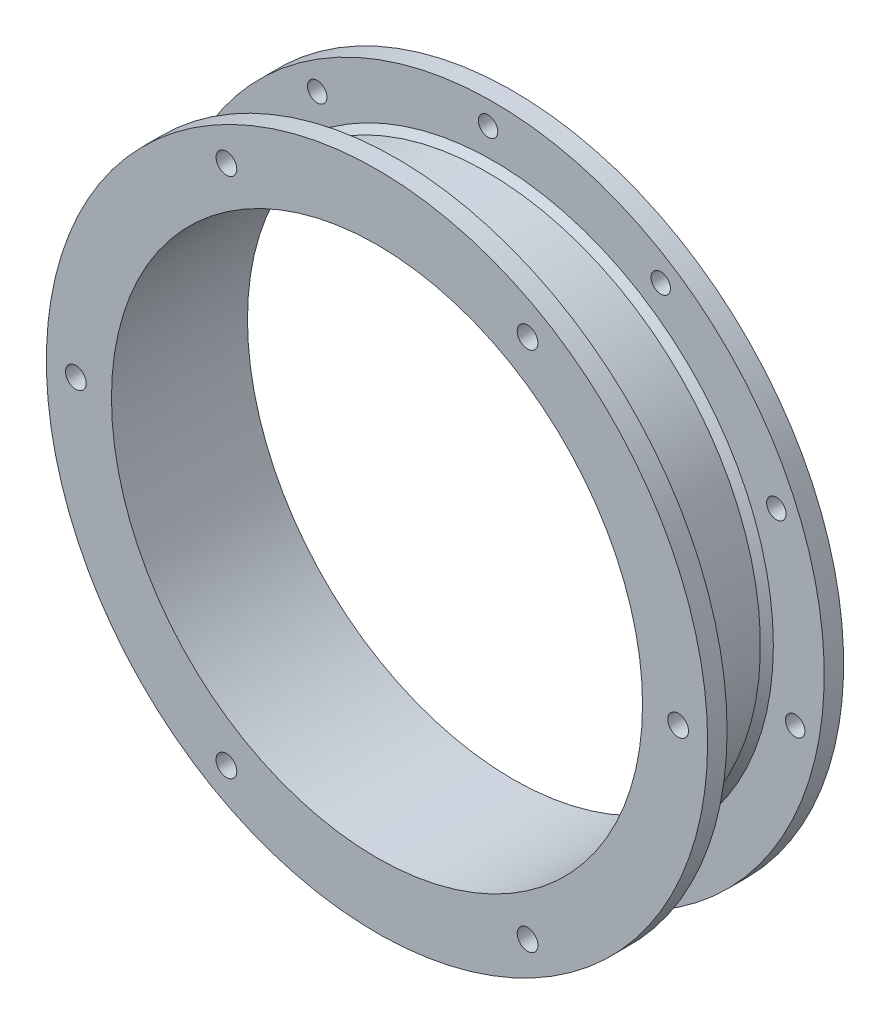
ISO-10303-21;
HEADER;
FILE_DESCRIPTION(('STEP AP214'),'2;1');
FILE_NAME('part.step','',(''),(''),'','','');
FILE_SCHEMA(('AUTOMOTIVE_DESIGN { 1 0 10303 214 1 1 1 1 }'));
ENDSEC;
DATA;
#1=APPLICATION_CONTEXT('core data for automotive mechanical design processes');
#2=APPLICATION_PROTOCOL_DEFINITION('international standard','automotive_design',2000,#1);
#3=PRODUCT_CONTEXT('',#1,'mechanical');
#4=PRODUCT('Part','Part','',(#3));
#5=PRODUCT_RELATED_PRODUCT_CATEGORY('part','',(#4));
#6=PRODUCT_DEFINITION_FORMATION('','',#4);
#7=PRODUCT_DEFINITION_CONTEXT('part definition',#1,'design');
#8=PRODUCT_DEFINITION('design','',#6,#7);
#9=PRODUCT_DEFINITION_SHAPE('','',#8);
#10=(LENGTH_UNIT() NAMED_UNIT(*) SI_UNIT(.MILLI.,.METRE.));
#11=(NAMED_UNIT(*) PLANE_ANGLE_UNIT() SI_UNIT($,.RADIAN.));
#12=(NAMED_UNIT(*) SI_UNIT($,.STERADIAN.) SOLID_ANGLE_UNIT());
#13=UNCERTAINTY_MEASURE_WITH_UNIT(LENGTH_MEASURE(1.E-05),#10,'distance_accuracy_value','');
#14=(GEOMETRIC_REPRESENTATION_CONTEXT(3) GLOBAL_UNCERTAINTY_ASSIGNED_CONTEXT((#13)) GLOBAL_UNIT_ASSIGNED_CONTEXT((#10,
#11,#12)) REPRESENTATION_CONTEXT('',''));
#15=CARTESIAN_POINT('',(0.,0.,0.));
#16=DIRECTION('',(0.,0.,1.));
#17=DIRECTION('',(1.,0.,0.));
#18=AXIS2_PLACEMENT_3D('',#15,#16,#17);
#19=CARTESIAN_POINT('',(-1.8002134656574,-86.,140.359624664289));
#20=DIRECTION('',(0.,0.,-1.));
#21=DIRECTION('',(-1.,0.,0.));
#22=AXIS2_PLACEMENT_3D('',#19,#20,#21);
#23=CYLINDRICAL_SURFACE('',#22,42.2);
#24=CARTESIAN_POINT('',(-1.8002134656574,-86.,17.));
#25=DIRECTION('',(0.,0.,1.));
#26=DIRECTION('',(1.,0.,0.));
#27=AXIS2_PLACEMENT_3D('',#24,#25,#26);
#28=CIRCLE('',#27,42.2);
#29=CARTESIAN_POINT('',(40.3997865343426,-86.,17.));
#30=VERTEX_POINT('',#29);
#31=EDGE_CURVE('E39',#30,#30,#28,.F.);
#32=ORIENTED_EDGE('',*,*,#31,.T.);
#33=EDGE_LOOP('',(#32));
#34=FACE_BOUND('',#33,.T.);
#35=CARTESIAN_POINT('',(-1.8002134656574,-86.,4.));
#36=DIRECTION('',(0.,0.,-1.));
#37=DIRECTION('',(-1.,0.,0.));
#38=AXIS2_PLACEMENT_3D('',#35,#36,#37);
#39=CIRCLE('',#38,42.2);
#40=CARTESIAN_POINT('',(-44.0002134656574,-86.,4.));
#41=VERTEX_POINT('',#40);
#42=EDGE_CURVE('E43',#41,#41,#39,.F.);
#43=ORIENTED_EDGE('',*,*,#42,.T.);
#44=EDGE_LOOP('',(#43));
#45=FACE_BOUND('',#44,.T.);
#46=ADVANCED_FACE('F32',(#34,#45),#23,.T.);
#47=CARTESIAN_POINT('',(-1.8002134656574,-86.,0.));
#48=DIRECTION('',(0.,0.,1.));
#49=DIRECTION('',(1.,0.,0.));
#50=AXIS2_PLACEMENT_3D('',#47,#48,#49);
#51=PLANE('',#50);
#52=CARTESIAN_POINT('',(44.7715124932127,-95.0289246310107,0.));
#53=DIRECTION('',(0.,0.,1.));
#54=DIRECTION('',(1.,0.,0.));
#55=AXIS2_PLACEMENT_3D('',#52,#53,#54);
#56=CIRCLE('',#55,1.5);
#57=CARTESIAN_POINT('',(46.2715124932127,-95.0289246310107,0.));
#58=VERTEX_POINT('',#57);
#59=EDGE_CURVE('E62',#58,#58,#56,.T.);
#60=ORIENTED_EDGE('',*,*,#59,.T.);
#61=EDGE_LOOP('',(#60));
#62=FACE_BOUND('',#61,.T.);
#63=CARTESIAN_POINT('',(-29.0290914471626,-47.1536958946046,0.));
#64=DIRECTION('',(0.,0.,1.));
#65=DIRECTION('',(1.,0.,0.));
#66=AXIS2_PLACEMENT_3D('',#63,#64,#65);
#67=CIRCLE('',#66,1.50000000000001);
#68=CARTESIAN_POINT('',(-27.5290914471626,-47.1536958946046,0.));
#69=VERTEX_POINT('',#68);
#70=EDGE_CURVE('E67',#69,#69,#67,.T.);
#71=ORIENTED_EDGE('',*,*,#70,.T.);
#72=EDGE_LOOP('',(#71));
#73=FACE_BOUND('',#72,.T.);
#74=CARTESIAN_POINT('',(-2.65139878903812,-38.5687590049994,0.));
#75=DIRECTION('',(0.,0.,1.));
#76=DIRECTION('',(1.,0.,0.));
#77=AXIS2_PLACEMENT_3D('',#74,#75,#76);
#78=CIRCLE('',#77,1.5);
#79=CARTESIAN_POINT('',(-1.15139878903812,-38.5687590049994,0.));
#80=VERTEX_POINT('',#79);
#81=EDGE_CURVE('E70',#80,#80,#78,.T.);
#82=ORIENTED_EDGE('',*,*,#81,.T.);
#83=EDGE_LOOP('',(#82));
#84=FACE_BOUND('',#83,.T.);
#85=CARTESIAN_POINT('',(41.8584077526162,-67.442739100291,0.));
#86=DIRECTION('',(0.,0.,1.));
#87=DIRECTION('',(1.,0.,0.));
#88=AXIS2_PLACEMENT_3D('',#85,#86,#87);
#89=CIRCLE('',#88,1.50000000000002);
#90=CARTESIAN_POINT('',(43.3584077526162,-67.442739100291,0.));
#91=VERTEX_POINT('',#90);
#92=EDGE_CURVE('E73',#91,#91,#89,.T.);
#93=ORIENTED_EDGE('',*,*,#92,.T.);
#94=EDGE_LOOP('',(#93));
#95=FACE_BOUND('',#94,.T.);
#96=CARTESIAN_POINT('',(24.0173352872677,-46.2017423098586,0.));
#97=DIRECTION('',(0.,0.,1.));
#98=DIRECTION('',(1.,0.,0.));
#99=AXIS2_PLACEMENT_3D('',#96,#97,#98);
#100=CIRCLE('',#99,1.5);
#101=CARTESIAN_POINT('',(25.5173352872677,-46.2017423098586,0.));
#102=VERTEX_POINT('',#101);
#103=EDGE_CURVE('E76',#102,#102,#100,.T.);
#104=ORIENTED_EDGE('',*,*,#103,.T.);
#105=EDGE_LOOP('',(#104));
#106=FACE_BOUND('',#105,.T.);
#107=CARTESIAN_POINT('',(-46.0965539526456,-69.0211496784566,0.));
#108=DIRECTION('',(0.,0.,1.));
#109=DIRECTION('',(1.,0.,0.));
#110=AXIS2_PLACEMENT_3D('',#107,#108,#109);
#111=CIRCLE('',#110,1.49999999999999);
#112=CARTESIAN_POINT('',(-44.5965539526456,-69.0211496784566,0.));
#113=VERTEX_POINT('',#112);
#114=EDGE_CURVE('E79',#113,#113,#111,.T.);
#115=ORIENTED_EDGE('',*,*,#114,.T.);
#116=EDGE_LOOP('',(#115));
#117=FACE_BOUND('',#116,.T.);
#118=CARTESIAN_POINT('',(-1.8002134656574,-86.,0.));
#119=DIRECTION('',(0.,0.,1.));
#120=DIRECTION('',(1.,0.,0.));
#121=AXIS2_PLACEMENT_3D('',#118,#119,#120);
#122=CIRCLE('',#121,41.);
#123=CARTESIAN_POINT('',(39.1997865343426,-86.,0.));
#124=VERTEX_POINT('',#123);
#125=EDGE_CURVE('E52',#124,#124,#122,.T.);
#126=ORIENTED_EDGE('',*,*,#125,.T.);
#127=EDGE_LOOP('',(#126));
#128=FACE_BOUND('',#127,.T.);
#129=CARTESIAN_POINT('',(-1.8002134656574,-86.,0.));
#130=DIRECTION('',(0.,0.,-1.));
#131=DIRECTION('',(-1.,0.,0.));
#132=AXIS2_PLACEMENT_3D('',#129,#130,#131);
#133=CIRCLE('',#132,51.0553108585789);
#134=CARTESIAN_POINT('',(-52.8555243242363,-86.,0.));
#135=VERTEX_POINT('',#134);
#136=EDGE_CURVE('E59',#135,#135,#133,.T.);
#137=ORIENTED_EDGE('',*,*,#136,.T.);
#138=EDGE_LOOP('',(#137));
#139=FACE_BOUND('',#138,.T.);
#140=ADVANCED_FACE('F189',(#62,#73,#84,#95,#106,#117,#128,#139),#51,.F.);
#141=CARTESIAN_POINT('',(-1.8002134656574,-86.,140.359624664289));
#142=DIRECTION('',(0.,0.,-1.));
#143=DIRECTION('',(-1.,0.,0.));
#144=AXIS2_PLACEMENT_3D('',#141,#142,#143);
#145=CYLINDRICAL_SURFACE('',#144,41.);
#146=ORIENTED_EDGE('',*,*,#125,.F.);
#147=EDGE_LOOP('',(#146));
#148=FACE_BOUND('',#147,.T.);
#149=CARTESIAN_POINT('',(-1.8002134656574,-86.,21.));
#150=DIRECTION('',(0.,0.,1.));
#151=DIRECTION('',(1.,0.,0.));
#152=AXIS2_PLACEMENT_3D('',#149,#150,#151);
#153=CIRCLE('',#152,41.);
#154=CARTESIAN_POINT('',(39.1997865343426,-86.,21.));
#155=VERTEX_POINT('',#154);
#156=EDGE_CURVE('E53',#155,#155,#153,.T.);
#157=ORIENTED_EDGE('',*,*,#156,.T.);
#158=EDGE_LOOP('',(#157));
#159=FACE_BOUND('',#158,.T.);
#160=ADVANCED_FACE('F158',(#148,#159),#145,.F.);
#161=CARTESIAN_POINT('',(-29.6610829408948,-97.5403499958335,21.));
#162=DIRECTION('',(0.,0.,1.));
#163=DIRECTION('',(-0.707106781186551,0.707106781186544,0.));
#164=AXIS2_PLACEMENT_3D('',#161,#162,#163);
#165=PLANE('',#164);
#166=ORIENTED_EDGE('',*,*,#156,.F.);
#167=EDGE_LOOP('',(#166));
#168=FACE_BOUND('',#167,.T.);
#169=CARTESIAN_POINT('',(-48.3002134656574,-86.0000000000003,21.));
#170=DIRECTION('',(0.,0.,1.));
#171=DIRECTION('',(1.,0.,0.));
#172=AXIS2_PLACEMENT_3D('',#169,#170,#171);
#173=CIRCLE('',#172,1.6);
#174=CARTESIAN_POINT('',(-46.7002134656574,-86.0000000000003,21.));
#175=VERTEX_POINT('',#174);
#176=EDGE_CURVE('E137',#175,#175,#173,.T.);
#177=ORIENTED_EDGE('',*,*,#176,.F.);
#178=EDGE_LOOP('',(#177));
#179=FACE_BOUND('',#178,.T.);
#180=CARTESIAN_POINT('',(-25.050213465657,-126.270181275977,21.));
#181=DIRECTION('',(0.,0.,1.));
#182=DIRECTION('',(1.,0.,0.));
#183=AXIS2_PLACEMENT_3D('',#180,#181,#182);
#184=CIRCLE('',#183,1.6);
#185=CARTESIAN_POINT('',(-23.450213465657,-126.270181275977,21.));
#186=VERTEX_POINT('',#185);
#187=EDGE_CURVE('E131',#186,#186,#184,.T.);
#188=ORIENTED_EDGE('',*,*,#187,.F.);
#189=EDGE_LOOP('',(#188));
#190=FACE_BOUND('',#189,.T.);
#191=CARTESIAN_POINT('',(21.4497865343431,-126.270181275976,21.));
#192=DIRECTION('',(0.,0.,1.));
#193=DIRECTION('',(1.,0.,0.));
#194=AXIS2_PLACEMENT_3D('',#191,#192,#193);
#195=CIRCLE('',#194,1.6);
#196=CARTESIAN_POINT('',(23.0497865343431,-126.270181275976,21.));
#197=VERTEX_POINT('',#196);
#198=EDGE_CURVE('E125',#197,#197,#195,.T.);
#199=ORIENTED_EDGE('',*,*,#198,.F.);
#200=EDGE_LOOP('',(#199));
#201=FACE_BOUND('',#200,.T.);
#202=CARTESIAN_POINT('',(44.6997865343426,-86.,21.));
#203=DIRECTION('',(0.,0.,1.));
#204=DIRECTION('',(1.,0.,0.));
#205=AXIS2_PLACEMENT_3D('',#202,#203,#204);
#206=CIRCLE('',#205,1.6);
#207=CARTESIAN_POINT('',(46.2997865343426,-86.,21.));
#208=VERTEX_POINT('',#207);
#209=EDGE_CURVE('E119',#208,#208,#206,.T.);
#210=ORIENTED_EDGE('',*,*,#209,.F.);
#211=EDGE_LOOP('',(#210));
#212=FACE_BOUND('',#211,.T.);
#213=CARTESIAN_POINT('',(21.4497865343425,-45.7298187240236,21.));
#214=DIRECTION('',(0.,0.,1.));
#215=DIRECTION('',(1.,0.,0.));
#216=AXIS2_PLACEMENT_3D('',#213,#214,#215);
#217=CIRCLE('',#216,1.6);
#218=CARTESIAN_POINT('',(23.0497865343425,-45.7298187240236,21.));
#219=VERTEX_POINT('',#218);
#220=EDGE_CURVE('E113',#219,#219,#217,.T.);
#221=ORIENTED_EDGE('',*,*,#220,.F.);
#222=EDGE_LOOP('',(#221));
#223=FACE_BOUND('',#222,.T.);
#224=CARTESIAN_POINT('',(-25.0502134656576,-45.7298187240237,21.));
#225=DIRECTION('',(0.,0.,1.));
#226=DIRECTION('',(1.,0.,0.));
#227=AXIS2_PLACEMENT_3D('',#224,#225,#226);
#228=CIRCLE('',#227,1.6);
#229=CARTESIAN_POINT('',(-23.4502134656576,-45.7298187240237,21.));
#230=VERTEX_POINT('',#229);
#231=EDGE_CURVE('E107',#230,#230,#228,.T.);
#232=ORIENTED_EDGE('',*,*,#231,.F.);
#233=EDGE_LOOP('',(#232));
#234=FACE_BOUND('',#233,.T.);
#235=CARTESIAN_POINT('',(-1.8002134656574,-86.,21.));
#236=DIRECTION('',(0.,0.,1.));
#237=DIRECTION('',(1.,0.,0.));
#238=AXIS2_PLACEMENT_3D('',#235,#236,#237);
#239=CIRCLE('',#238,51.0553108585789);
#240=CARTESIAN_POINT('',(49.2550973929215,-86.,21.));
#241=VERTEX_POINT('',#240);
#242=EDGE_CURVE('E101',#241,#241,#239,.T.);
#243=ORIENTED_EDGE('',*,*,#242,.T.);
#244=EDGE_LOOP('',(#243));
#245=FACE_BOUND('',#244,.T.);
#246=ADVANCED_FACE('F154',(#168,#179,#190,#201,#212,#223,#234,#245),#165,.T.);
#247=CARTESIAN_POINT('',(-1.8002134656574,-86.,3.));
#248=DIRECTION('',(0.,0.,-1.));
#249=DIRECTION('',(-1.,0.,0.));
#250=AXIS2_PLACEMENT_3D('',#247,#248,#249);
#251=CYLINDRICAL_SURFACE('',#250,51.0553108585789);
#252=CARTESIAN_POINT('',(-1.8002134656574,-86.,3.));
#253=DIRECTION('',(0.,0.,-1.));
#254=DIRECTION('',(-1.,0.,0.));
#255=AXIS2_PLACEMENT_3D('',#252,#253,#254);
#256=CIRCLE('',#255,51.0553108585789);
#257=CARTESIAN_POINT('',(-52.8555243242363,-86.,3.));
#258=VERTEX_POINT('',#257);
#259=EDGE_CURVE('E56',#258,#258,#256,.T.);
#260=ORIENTED_EDGE('',*,*,#259,.T.);
#261=EDGE_LOOP('',(#260));
#262=FACE_BOUND('',#261,.T.);
#263=ORIENTED_EDGE('',*,*,#136,.F.);
#264=EDGE_LOOP('',(#263));
#265=FACE_BOUND('',#264,.T.);
#266=ADVANCED_FACE('F157',(#262,#265),#251,.T.);
#267=CARTESIAN_POINT('',(-1.8002134656574,-86.,3.));
#268=DIRECTION('',(0.,0.,-1.));
#269=DIRECTION('',(-1.,0.,0.));
#270=AXIS2_PLACEMENT_3D('',#267,#268,#269);
#271=PLANE('',#270);
#272=CARTESIAN_POINT('',(-1.8002134656574,-86.,3.));
#273=DIRECTION('',(0.,0.,-1.));
#274=DIRECTION('',(-1.,0.,0.));
#275=AXIS2_PLACEMENT_3D('',#272,#273,#274);
#276=CIRCLE('',#275,43.2);
#277=CARTESIAN_POINT('',(-45.0002134656574,-86.,3.));
#278=VERTEX_POINT('',#277);
#279=EDGE_CURVE('E10',#278,#278,#276,.T.);
#280=ORIENTED_EDGE('',*,*,#279,.T.);
#281=EDGE_LOOP('',(#280));
#282=FACE_BOUND('',#281,.T.);
#283=CARTESIAN_POINT('',(44.7715124932127,-95.0289246310107,3.));
#284=DIRECTION('',(0.,0.,1.));
#285=DIRECTION('',(1.,0.,0.));
#286=AXIS2_PLACEMENT_3D('',#283,#284,#285);
#287=CIRCLE('',#286,1.5);
#288=CARTESIAN_POINT('',(46.2715124932127,-95.0289246310107,3.));
#289=VERTEX_POINT('',#288);
#290=EDGE_CURVE('E82',#289,#289,#287,.T.);
#291=ORIENTED_EDGE('',*,*,#290,.F.);
#292=EDGE_LOOP('',(#291));
#293=FACE_BOUND('',#292,.T.);
#294=CARTESIAN_POINT('',(-29.0290914471626,-47.1536958946046,3.));
#295=DIRECTION('',(0.,0.,1.));
#296=DIRECTION('',(1.,0.,0.));
#297=AXIS2_PLACEMENT_3D('',#294,#295,#296);
#298=CIRCLE('',#297,1.50000000000001);
#299=CARTESIAN_POINT('',(-27.5290914471626,-47.1536958946046,3.));
#300=VERTEX_POINT('',#299);
#301=EDGE_CURVE('E93',#300,#300,#298,.T.);
#302=ORIENTED_EDGE('',*,*,#301,.F.);
#303=EDGE_LOOP('',(#302));
#304=FACE_BOUND('',#303,.T.);
#305=CARTESIAN_POINT('',(-2.65139878903812,-38.5687590049994,3.));
#306=DIRECTION('',(0.,0.,1.));
#307=DIRECTION('',(1.,0.,0.));
#308=AXIS2_PLACEMENT_3D('',#305,#306,#307);
#309=CIRCLE('',#308,1.5);
#310=CARTESIAN_POINT('',(-1.15139878903812,-38.5687590049994,3.));
#311=VERTEX_POINT('',#310);
#312=EDGE_CURVE('E86',#311,#311,#309,.T.);
#313=ORIENTED_EDGE('',*,*,#312,.F.);
#314=EDGE_LOOP('',(#313));
#315=FACE_BOUND('',#314,.T.);
#316=CARTESIAN_POINT('',(41.8584077526162,-67.442739100291,3.));
#317=DIRECTION('',(0.,0.,1.));
#318=DIRECTION('',(1.,0.,0.));
#319=AXIS2_PLACEMENT_3D('',#316,#317,#318);
#320=CIRCLE('',#319,1.50000000000002);
#321=CARTESIAN_POINT('',(43.3584077526162,-67.442739100291,3.));
#322=VERTEX_POINT('',#321);
#323=EDGE_CURVE('E83',#322,#322,#320,.T.);
#324=ORIENTED_EDGE('',*,*,#323,.F.);
#325=EDGE_LOOP('',(#324));
#326=FACE_BOUND('',#325,.T.);
#327=CARTESIAN_POINT('',(24.0173352872677,-46.2017423098586,3.));
#328=DIRECTION('',(0.,0.,1.));
#329=DIRECTION('',(1.,0.,0.));
#330=AXIS2_PLACEMENT_3D('',#327,#328,#329);
#331=CIRCLE('',#330,1.5);
#332=CARTESIAN_POINT('',(25.5173352872677,-46.2017423098586,3.));
#333=VERTEX_POINT('',#332);
#334=EDGE_CURVE('E87',#333,#333,#331,.T.);
#335=ORIENTED_EDGE('',*,*,#334,.F.);
#336=EDGE_LOOP('',(#335));
#337=FACE_BOUND('',#336,.T.);
#338=CARTESIAN_POINT('',(-46.0965539526456,-69.0211496784566,3.));
#339=DIRECTION('',(0.,0.,1.));
#340=DIRECTION('',(1.,0.,0.));
#341=AXIS2_PLACEMENT_3D('',#338,#339,#340);
#342=CIRCLE('',#341,1.49999999999999);
#343=CARTESIAN_POINT('',(-44.5965539526456,-69.0211496784566,3.));
#344=VERTEX_POINT('',#343);
#345=EDGE_CURVE('E90',#344,#344,#342,.T.);
#346=ORIENTED_EDGE('',*,*,#345,.F.);
#347=EDGE_LOOP('',(#346));
#348=FACE_BOUND('',#347,.T.);
#349=ORIENTED_EDGE('',*,*,#259,.F.);
#350=EDGE_LOOP('',(#349));
#351=FACE_BOUND('',#350,.T.);
#352=ADVANCED_FACE('F229',(#282,#293,#304,#315,#326,#337,#348,#351),#271,.F.);
#353=CARTESIAN_POINT('',(-46.0965539526456,-69.0211496784566,-9.));
#354=DIRECTION('',(0.,0.,1.));
#355=DIRECTION('',(1.,0.,0.));
#356=AXIS2_PLACEMENT_3D('',#353,#354,#355);
#357=CYLINDRICAL_SURFACE('',#356,1.49999999999999);
#358=ORIENTED_EDGE('',*,*,#345,.T.);
#359=EDGE_LOOP('',(#358));
#360=FACE_BOUND('',#359,.T.);
#361=ORIENTED_EDGE('',*,*,#114,.F.);
#362=EDGE_LOOP('',(#361));
#363=FACE_BOUND('',#362,.T.);
#364=ADVANCED_FACE('F233',(#360,#363),#357,.F.);
#365=CARTESIAN_POINT('',(24.0173352872677,-46.2017423098586,-9.));
#366=DIRECTION('',(0.,0.,1.));
#367=DIRECTION('',(1.,0.,0.));
#368=AXIS2_PLACEMENT_3D('',#365,#366,#367);
#369=CYLINDRICAL_SURFACE('',#368,1.5);
#370=ORIENTED_EDGE('',*,*,#334,.T.);
#371=EDGE_LOOP('',(#370));
#372=FACE_BOUND('',#371,.T.);
#373=ORIENTED_EDGE('',*,*,#103,.F.);
#374=EDGE_LOOP('',(#373));
#375=FACE_BOUND('',#374,.T.);
#376=ADVANCED_FACE('F339',(#372,#375),#369,.F.);
#377=CARTESIAN_POINT('',(41.8584077526162,-67.442739100291,-9.));
#378=DIRECTION('',(0.,0.,1.));
#379=DIRECTION('',(1.,0.,0.));
#380=AXIS2_PLACEMENT_3D('',#377,#378,#379);
#381=CYLINDRICAL_SURFACE('',#380,1.50000000000002);
#382=ORIENTED_EDGE('',*,*,#323,.T.);
#383=EDGE_LOOP('',(#382));
#384=FACE_BOUND('',#383,.T.);
#385=ORIENTED_EDGE('',*,*,#92,.F.);
#386=EDGE_LOOP('',(#385));
#387=FACE_BOUND('',#386,.T.);
#388=ADVANCED_FACE('F329',(#384,#387),#381,.F.);
#389=CARTESIAN_POINT('',(-2.65139878903812,-38.5687590049994,-9.));
#390=DIRECTION('',(0.,0.,1.));
#391=DIRECTION('',(1.,0.,0.));
#392=AXIS2_PLACEMENT_3D('',#389,#390,#391);
#393=CYLINDRICAL_SURFACE('',#392,1.5);
#394=ORIENTED_EDGE('',*,*,#312,.T.);
#395=EDGE_LOOP('',(#394));
#396=FACE_BOUND('',#395,.T.);
#397=ORIENTED_EDGE('',*,*,#81,.F.);
#398=EDGE_LOOP('',(#397));
#399=FACE_BOUND('',#398,.T.);
#400=ADVANCED_FACE('F319',(#396,#399),#393,.F.);
#401=CARTESIAN_POINT('',(-29.0290914471626,-47.1536958946046,-9.));
#402=DIRECTION('',(0.,0.,1.));
#403=DIRECTION('',(1.,0.,0.));
#404=AXIS2_PLACEMENT_3D('',#401,#402,#403);
#405=CYLINDRICAL_SURFACE('',#404,1.50000000000001);
#406=ORIENTED_EDGE('',*,*,#301,.T.);
#407=EDGE_LOOP('',(#406));
#408=FACE_BOUND('',#407,.T.);
#409=ORIENTED_EDGE('',*,*,#70,.F.);
#410=EDGE_LOOP('',(#409));
#411=FACE_BOUND('',#410,.T.);
#412=ADVANCED_FACE('F185',(#408,#411),#405,.F.);
#413=CARTESIAN_POINT('',(44.7715124932127,-95.0289246310107,-9.));
#414=DIRECTION('',(0.,0.,1.));
#415=DIRECTION('',(1.,0.,0.));
#416=AXIS2_PLACEMENT_3D('',#413,#414,#415);
#417=CYLINDRICAL_SURFACE('',#416,1.5);
#418=ORIENTED_EDGE('',*,*,#290,.T.);
#419=EDGE_LOOP('',(#418));
#420=FACE_BOUND('',#419,.T.);
#421=ORIENTED_EDGE('',*,*,#59,.F.);
#422=EDGE_LOOP('',(#421));
#423=FACE_BOUND('',#422,.T.);
#424=ADVANCED_FACE('F175',(#420,#423),#417,.F.);
#425=CARTESIAN_POINT('',(-1.8002134656574,-86.,18.));
#426=DIRECTION('',(0.,0.,1.));
#427=DIRECTION('',(1.,0.,0.));
#428=AXIS2_PLACEMENT_3D('',#425,#426,#427);
#429=CYLINDRICAL_SURFACE('',#428,51.0553108585789);
#430=CARTESIAN_POINT('',(-1.8002134656574,-86.,18.));
#431=DIRECTION('',(0.,0.,1.));
#432=DIRECTION('',(1.,0.,0.));
#433=AXIS2_PLACEMENT_3D('',#430,#431,#432);
#434=CIRCLE('',#433,51.0553108585789);
#435=CARTESIAN_POINT('',(49.2550973929215,-86.,18.));
#436=VERTEX_POINT('',#435);
#437=EDGE_CURVE('E98',#436,#436,#434,.T.);
#438=ORIENTED_EDGE('',*,*,#437,.T.);
#439=EDGE_LOOP('',(#438));
#440=FACE_BOUND('',#439,.T.);
#441=ORIENTED_EDGE('',*,*,#242,.F.);
#442=EDGE_LOOP('',(#441));
#443=FACE_BOUND('',#442,.T.);
#444=ADVANCED_FACE('F173',(#440,#443),#429,.T.);
#445=CARTESIAN_POINT('',(-1.8002134656574,-86.,18.));
#446=DIRECTION('',(0.,0.,1.));
#447=DIRECTION('',(1.,0.,0.));
#448=AXIS2_PLACEMENT_3D('',#445,#446,#447);
#449=PLANE('',#448);
#450=CARTESIAN_POINT('',(-1.8002134656574,-86.,18.));
#451=DIRECTION('',(0.,0.,1.));
#452=DIRECTION('',(1.,0.,0.));
#453=AXIS2_PLACEMENT_3D('',#450,#451,#452);
#454=CIRCLE('',#453,43.2);
#455=CARTESIAN_POINT('',(41.3997865343426,-86.,18.));
#456=VERTEX_POINT('',#455);
#457=EDGE_CURVE('E47',#456,#456,#454,.T.);
#458=ORIENTED_EDGE('',*,*,#457,.T.);
#459=EDGE_LOOP('',(#458));
#460=FACE_BOUND('',#459,.T.);
#461=CARTESIAN_POINT('',(-48.3002134656574,-86.0000000000003,18.));
#462=DIRECTION('',(0.,0.,1.));
#463=DIRECTION('',(1.,0.,0.));
#464=AXIS2_PLACEMENT_3D('',#461,#462,#463);
#465=CIRCLE('',#464,1.6);
#466=CARTESIAN_POINT('',(-46.7002134656574,-86.0000000000003,18.));
#467=VERTEX_POINT('',#466);
#468=EDGE_CURVE('E134',#467,#467,#465,.T.);
#469=ORIENTED_EDGE('',*,*,#468,.T.);
#470=EDGE_LOOP('',(#469));
#471=FACE_BOUND('',#470,.T.);
#472=CARTESIAN_POINT('',(-25.050213465657,-126.270181275977,18.));
#473=DIRECTION('',(0.,0.,1.));
#474=DIRECTION('',(1.,0.,0.));
#475=AXIS2_PLACEMENT_3D('',#472,#473,#474);
#476=CIRCLE('',#475,1.6);
#477=CARTESIAN_POINT('',(-23.450213465657,-126.270181275977,18.));
#478=VERTEX_POINT('',#477);
#479=EDGE_CURVE('E128',#478,#478,#476,.T.);
#480=ORIENTED_EDGE('',*,*,#479,.T.);
#481=EDGE_LOOP('',(#480));
#482=FACE_BOUND('',#481,.T.);
#483=CARTESIAN_POINT('',(21.4497865343431,-126.270181275976,18.));
#484=DIRECTION('',(0.,0.,1.));
#485=DIRECTION('',(1.,0.,0.));
#486=AXIS2_PLACEMENT_3D('',#483,#484,#485);
#487=CIRCLE('',#486,1.6);
#488=CARTESIAN_POINT('',(23.0497865343431,-126.270181275976,18.));
#489=VERTEX_POINT('',#488);
#490=EDGE_CURVE('E122',#489,#489,#487,.T.);
#491=ORIENTED_EDGE('',*,*,#490,.T.);
#492=EDGE_LOOP('',(#491));
#493=FACE_BOUND('',#492,.T.);
#494=CARTESIAN_POINT('',(44.6997865343426,-86.,18.));
#495=DIRECTION('',(0.,0.,1.));
#496=DIRECTION('',(1.,0.,0.));
#497=AXIS2_PLACEMENT_3D('',#494,#495,#496);
#498=CIRCLE('',#497,1.6);
#499=CARTESIAN_POINT('',(46.2997865343426,-86.,18.));
#500=VERTEX_POINT('',#499);
#501=EDGE_CURVE('E116',#500,#500,#498,.T.);
#502=ORIENTED_EDGE('',*,*,#501,.T.);
#503=EDGE_LOOP('',(#502));
#504=FACE_BOUND('',#503,.T.);
#505=CARTESIAN_POINT('',(21.4497865343425,-45.7298187240236,18.));
#506=DIRECTION('',(0.,0.,1.));
#507=DIRECTION('',(1.,0.,0.));
#508=AXIS2_PLACEMENT_3D('',#505,#506,#507);
#509=CIRCLE('',#508,1.6);
#510=CARTESIAN_POINT('',(23.0497865343425,-45.7298187240236,18.));
#511=VERTEX_POINT('',#510);
#512=EDGE_CURVE('E110',#511,#511,#509,.T.);
#513=ORIENTED_EDGE('',*,*,#512,.T.);
#514=EDGE_LOOP('',(#513));
#515=FACE_BOUND('',#514,.T.);
#516=CARTESIAN_POINT('',(-25.0502134656576,-45.7298187240237,18.));
#517=DIRECTION('',(0.,0.,1.));
#518=DIRECTION('',(1.,0.,0.));
#519=AXIS2_PLACEMENT_3D('',#516,#517,#518);
#520=CIRCLE('',#519,1.6);
#521=CARTESIAN_POINT('',(-23.4502134656576,-45.7298187240237,18.));
#522=VERTEX_POINT('',#521);
#523=EDGE_CURVE('E104',#522,#522,#520,.T.);
#524=ORIENTED_EDGE('',*,*,#523,.T.);
#525=EDGE_LOOP('',(#524));
#526=FACE_BOUND('',#525,.T.);
#527=ORIENTED_EDGE('',*,*,#437,.F.);
#528=EDGE_LOOP('',(#527));
#529=FACE_BOUND('',#528,.T.);
#530=ADVANCED_FACE('F143',(#460,#471,#482,#493,#504,#515,#526,#529),#449,.F.);
#531=CARTESIAN_POINT('',(-25.0502134656576,-45.7298187240237,18.));
#532=DIRECTION('',(0.,0.,1.));
#533=DIRECTION('',(1.,0.,0.));
#534=AXIS2_PLACEMENT_3D('',#531,#532,#533);
#535=CYLINDRICAL_SURFACE('',#534,1.6);
#536=ORIENTED_EDGE('',*,*,#523,.F.);
#537=EDGE_LOOP('',(#536));
#538=FACE_BOUND('',#537,.T.);
#539=ORIENTED_EDGE('',*,*,#231,.T.);
#540=EDGE_LOOP('',(#539));
#541=FACE_BOUND('',#540,.T.);
#542=ADVANCED_FACE('F182',(#538,#541),#535,.F.);
#543=CARTESIAN_POINT('',(21.4497865343425,-45.7298187240236,18.));
#544=DIRECTION('',(0.,0.,1.));
#545=DIRECTION('',(1.,0.,0.));
#546=AXIS2_PLACEMENT_3D('',#543,#544,#545);
#547=CYLINDRICAL_SURFACE('',#546,1.6);
#548=ORIENTED_EDGE('',*,*,#512,.F.);
#549=EDGE_LOOP('',(#548));
#550=FACE_BOUND('',#549,.T.);
#551=ORIENTED_EDGE('',*,*,#220,.T.);
#552=EDGE_LOOP('',(#551));
#553=FACE_BOUND('',#552,.T.);
#554=ADVANCED_FACE('F278',(#550,#553),#547,.F.);
#555=CARTESIAN_POINT('',(44.6997865343426,-86.,18.));
#556=DIRECTION('',(0.,0.,1.));
#557=DIRECTION('',(1.,0.,0.));
#558=AXIS2_PLACEMENT_3D('',#555,#556,#557);
#559=CYLINDRICAL_SURFACE('',#558,1.6);
#560=ORIENTED_EDGE('',*,*,#501,.F.);
#561=EDGE_LOOP('',(#560));
#562=FACE_BOUND('',#561,.T.);
#563=ORIENTED_EDGE('',*,*,#209,.T.);
#564=EDGE_LOOP('',(#563));
#565=FACE_BOUND('',#564,.T.);
#566=ADVANCED_FACE('F268',(#562,#565),#559,.F.);
#567=CARTESIAN_POINT('',(21.4497865343431,-126.270181275976,18.));
#568=DIRECTION('',(0.,0.,1.));
#569=DIRECTION('',(1.,0.,0.));
#570=AXIS2_PLACEMENT_3D('',#567,#568,#569);
#571=CYLINDRICAL_SURFACE('',#570,1.6);
#572=ORIENTED_EDGE('',*,*,#490,.F.);
#573=EDGE_LOOP('',(#572));
#574=FACE_BOUND('',#573,.T.);
#575=ORIENTED_EDGE('',*,*,#198,.T.);
#576=EDGE_LOOP('',(#575));
#577=FACE_BOUND('',#576,.T.);
#578=ADVANCED_FACE('F258',(#574,#577),#571,.F.);
#579=CARTESIAN_POINT('',(-25.050213465657,-126.270181275977,18.));
#580=DIRECTION('',(0.,0.,1.));
#581=DIRECTION('',(1.,0.,0.));
#582=AXIS2_PLACEMENT_3D('',#579,#580,#581);
#583=CYLINDRICAL_SURFACE('',#582,1.6);
#584=ORIENTED_EDGE('',*,*,#479,.F.);
#585=EDGE_LOOP('',(#584));
#586=FACE_BOUND('',#585,.T.);
#587=ORIENTED_EDGE('',*,*,#187,.T.);
#588=EDGE_LOOP('',(#587));
#589=FACE_BOUND('',#588,.T.);
#590=ADVANCED_FACE('F150',(#586,#589),#583,.F.);
#591=CARTESIAN_POINT('',(-48.3002134656574,-86.0000000000003,18.));
#592=DIRECTION('',(0.,0.,1.));
#593=DIRECTION('',(1.,0.,0.));
#594=AXIS2_PLACEMENT_3D('',#591,#592,#593);
#595=CYLINDRICAL_SURFACE('',#594,1.6);
#596=ORIENTED_EDGE('',*,*,#468,.F.);
#597=EDGE_LOOP('',(#596));
#598=FACE_BOUND('',#597,.T.);
#599=ORIENTED_EDGE('',*,*,#176,.T.);
#600=EDGE_LOOP('',(#599));
#601=FACE_BOUND('',#600,.T.);
#602=ADVANCED_FACE('F146',(#598,#601),#595,.F.);
#603=CARTESIAN_POINT('',(-1.8002134656574,-86.,18.));
#604=DIRECTION('',(0.,0.,1.));
#605=DIRECTION('',(1.,0.,0.));
#606=AXIS2_PLACEMENT_3D('',#603,#604,#605);
#607=CONICAL_SURFACE('',#606,43.2,0.785398163397459);
#608=ORIENTED_EDGE('',*,*,#31,.F.);
#609=EDGE_LOOP('',(#608));
#610=FACE_BOUND('',#609,.T.);
#611=ORIENTED_EDGE('',*,*,#457,.F.);
#612=EDGE_LOOP('',(#611));
#613=FACE_BOUND('',#612,.T.);
#614=ADVANCED_FACE('F149',(#610,#613),#607,.T.);
#615=CARTESIAN_POINT('',(-1.8002134656574,-86.,3.));
#616=DIRECTION('',(0.,0.,-1.));
#617=DIRECTION('',(-1.,0.,0.));
#618=AXIS2_PLACEMENT_3D('',#615,#616,#617);
#619=CONICAL_SURFACE('',#618,43.2,0.785398163397455);
#620=ORIENTED_EDGE('',*,*,#42,.F.);
#621=EDGE_LOOP('',(#620));
#622=FACE_BOUND('',#621,.T.);
#623=ORIENTED_EDGE('',*,*,#279,.F.);
#624=EDGE_LOOP('',(#623));
#625=FACE_BOUND('',#624,.T.);
#626=ADVANCED_FACE('F34',(#622,#625),#619,.T.);
#627=CLOSED_SHELL('',(#46,#140,#160,#246,#266,#352,#364,#376,#388,#400,#412,#424,#444,#530,#542,
#554,#566,#578,#590,#602,#614,#626));
#628=MANIFOLD_SOLID_BREP('B2',#627);
#629=ADVANCED_BREP_SHAPE_REPRESENTATION('',(#18,#628),#14);
#630=SHAPE_DEFINITION_REPRESENTATION(#9,#629);
ENDSEC;
END-ISO-10303-21;
